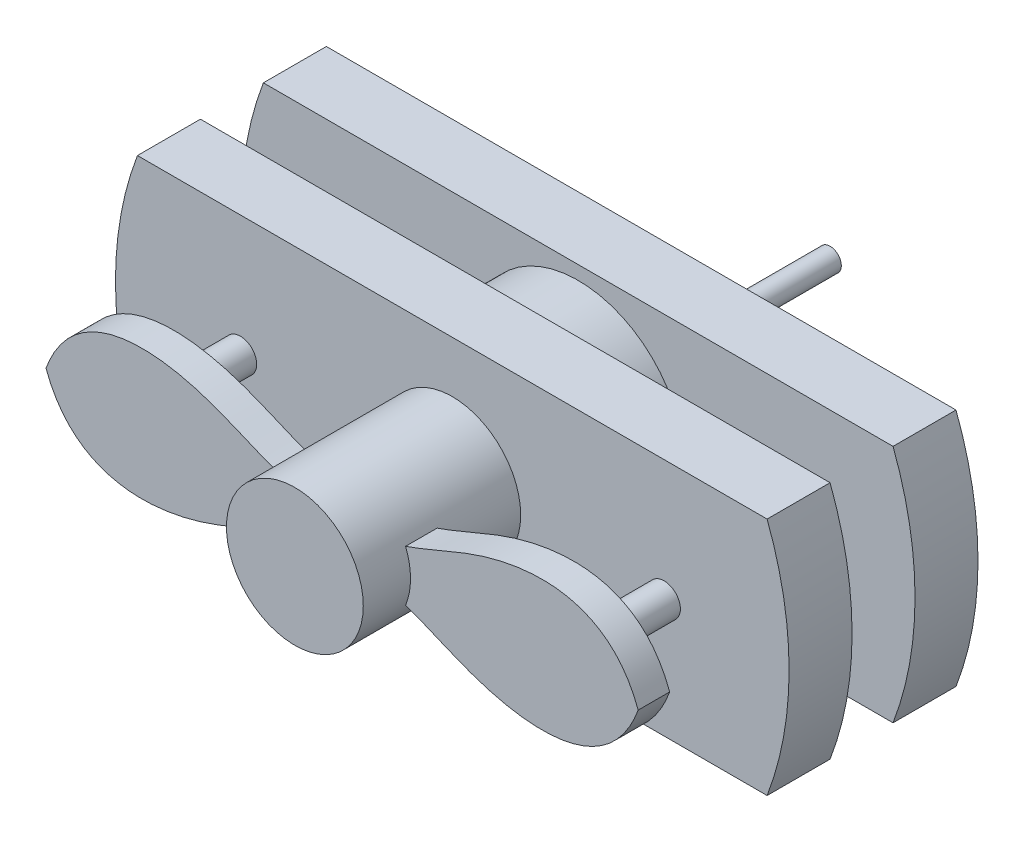
ISO-10303-21;
HEADER;
FILE_DESCRIPTION(('STEP AP214'),'2;1');
FILE_NAME('part.step','',(''),(''),'','','');
FILE_SCHEMA(('AUTOMOTIVE_DESIGN { 1 0 10303 214 1 1 1 1 }'));
ENDSEC;
DATA;
#1=APPLICATION_CONTEXT('core data for automotive mechanical design processes');
#2=APPLICATION_PROTOCOL_DEFINITION('international standard','automotive_design',2000,#1);
#3=PRODUCT_CONTEXT('',#1,'mechanical');
#4=PRODUCT('Part','Part','',(#3));
#5=PRODUCT_RELATED_PRODUCT_CATEGORY('part','',(#4));
#6=PRODUCT_DEFINITION_FORMATION('','',#4);
#7=PRODUCT_DEFINITION_CONTEXT('part definition',#1,'design');
#8=PRODUCT_DEFINITION('design','',#6,#7);
#9=PRODUCT_DEFINITION_SHAPE('','',#8);
#10=(LENGTH_UNIT() NAMED_UNIT(*) SI_UNIT(.MILLI.,.METRE.));
#11=(NAMED_UNIT(*) PLANE_ANGLE_UNIT() SI_UNIT($,.RADIAN.));
#12=(NAMED_UNIT(*) SI_UNIT($,.STERADIAN.) SOLID_ANGLE_UNIT());
#13=UNCERTAINTY_MEASURE_WITH_UNIT(LENGTH_MEASURE(1.E-05),#10,'distance_accuracy_value','');
#14=(GEOMETRIC_REPRESENTATION_CONTEXT(3) GLOBAL_UNCERTAINTY_ASSIGNED_CONTEXT((#13)) GLOBAL_UNIT_ASSIGNED_CONTEXT((#10,
#11,#12)) REPRESENTATION_CONTEXT('',''));
#15=CARTESIAN_POINT('',(0.,0.,0.));
#16=DIRECTION('',(0.,0.,1.));
#17=DIRECTION('',(1.,0.,0.));
#18=AXIS2_PLACEMENT_3D('',#15,#16,#17);
#19=CARTESIAN_POINT('',(0.755698973987045,4.82947367232855,12.065));
#20=CARTESIAN_POINT('',(1.86014304103616,1.82870450723201,12.065));
#21=CARTESIAN_POINT('',(7.0613499811201,1.87919125199209,12.065));
#22=CARTESIAN_POINT('',(10.5892667055945,4.31869419361788,12.065));
#23=CARTESIAN_POINT('',(12.7,4.20147434003299,12.065));
#24=B_SPLINE_CURVE_WITH_KNOTS('',3,(#19,#20,#21,#22,#23),.UNSPECIFIED.,.F.,.F.,(4,1,4),(0.,
0.565556179346846,1.),.UNSPECIFIED.);
#25=DIRECTION('',(0.,0.,-1.));
#26=VECTOR('',#25,1.);
#27=SURFACE_OF_LINEAR_EXTRUSION('',#24,#26);
#28=DIRECTION('',(0.,0.,-1.));
#29=VECTOR('',#28,1.);
#30=CARTESIAN_POINT('',(10.1397042127752,3.79972743013011,12.065));
#31=LINE('',#30,#29);
#32=CARTESIAN_POINT('',(10.1397042127752,3.79972743013011,12.065));
#33=VERTEX_POINT('',#32);
#34=CARTESIAN_POINT('',(10.1397042127752,3.79972743013011,10.795));
#35=VERTEX_POINT('',#34);
#36=EDGE_CURVE('E221',#33,#35,#31,.T.);
#37=ORIENTED_EDGE('',*,*,#36,.F.);
#38=CARTESIAN_POINT('',(0.755698973987044,4.82947367232855,12.065));
#39=VERTEX_POINT('',#38);
#40=EDGE_CURVE('E170',#39,#33,#24,.T.);
#41=ORIENTED_EDGE('',*,*,#40,.F.);
#42=DIRECTION('',(0.,0.,-1.));
#43=VECTOR('',#42,1.);
#44=CARTESIAN_POINT('',(0.755698973987044,4.82947367232855,12.065));
#45=LINE('',#44,#43);
#46=CARTESIAN_POINT('',(0.755698973987044,4.82947367232855,10.795));
#47=VERTEX_POINT('',#46);
#48=EDGE_CURVE('E168',#39,#47,#45,.T.);
#49=ORIENTED_EDGE('',*,*,#48,.T.);
#50=CARTESIAN_POINT('',(0.755698973987045,4.82947367232855,10.795));
#51=CARTESIAN_POINT('',(1.86014304103616,1.82870450723201,10.795));
#52=CARTESIAN_POINT('',(7.0613499811201,1.87919125199209,10.795));
#53=CARTESIAN_POINT('',(10.5892667055945,4.31869419361788,10.795));
#54=CARTESIAN_POINT('',(12.7,4.20147434003299,10.795));
#55=B_SPLINE_CURVE_WITH_KNOTS('',3,(#50,#51,#52,#53,#54),.UNSPECIFIED.,.F.,.F.,(4,1,4),(0.,
0.565556179346846,1.),.UNSPECIFIED.);
#56=EDGE_CURVE('E216',#47,#35,#55,.T.);
#57=ORIENTED_EDGE('',*,*,#56,.T.);
#58=EDGE_LOOP('',(#37,#41,#49,#57));
#59=FACE_BOUND('',#58,.T.);
#60=ADVANCED_FACE('F45',(#59),#27,.F.);
#61=CARTESIAN_POINT('',(12.7,4.20147434003299,12.065));
#62=CARTESIAN_POINT('',(14.8107332944055,4.31869419361788,12.065));
#63=CARTESIAN_POINT('',(18.3386500188799,1.8791912519921,12.065));
#64=CARTESIAN_POINT('',(23.5398569589638,1.82870450723202,12.065));
#65=CARTESIAN_POINT('',(24.644301026013,4.82947367232855,12.065));
#66=B_SPLINE_CURVE_WITH_KNOTS('',3,(#61,#62,#63,#64,#65),.UNSPECIFIED.,.F.,.F.,(4,1,4),(0.,
0.434443820653154,1.),.UNSPECIFIED.);
#67=DIRECTION('',(0.,0.,-1.));
#68=VECTOR('',#67,1.);
#69=SURFACE_OF_LINEAR_EXTRUSION('',#66,#68);
#70=DIRECTION('',(0.,0.,-1.));
#71=VECTOR('',#70,1.);
#72=CARTESIAN_POINT('',(15.2602957872248,3.79972743013011,12.065));
#73=LINE('',#72,#71);
#74=CARTESIAN_POINT('',(15.2602957872248,3.79972743013011,10.795));
#75=VERTEX_POINT('',#74);
#76=CARTESIAN_POINT('',(15.2602957872248,3.79972743013011,12.065));
#77=VERTEX_POINT('',#76);
#78=EDGE_CURVE('E68',#75,#77,#73,.F.);
#79=ORIENTED_EDGE('',*,*,#78,.F.);
#80=CARTESIAN_POINT('',(12.7,4.20147434003299,10.795));
#81=CARTESIAN_POINT('',(14.8107332944055,4.31869419361788,10.795));
#82=CARTESIAN_POINT('',(18.3386500188799,1.8791912519921,10.795));
#83=CARTESIAN_POINT('',(23.5398569589638,1.82870450723202,10.795));
#84=CARTESIAN_POINT('',(24.644301026013,4.82947367232855,10.795));
#85=B_SPLINE_CURVE_WITH_KNOTS('',3,(#80,#81,#82,#83,#84),.UNSPECIFIED.,.F.,.F.,(4,1,4),(0.,
0.434443820653154,1.),.UNSPECIFIED.);
#86=CARTESIAN_POINT('',(24.644301026013,4.82947367232855,10.795));
#87=VERTEX_POINT('',#86);
#88=EDGE_CURVE('E369',#75,#87,#85,.T.);
#89=ORIENTED_EDGE('',*,*,#88,.T.);
#90=DIRECTION('',(0.,0.,-1.));
#91=VECTOR('',#90,1.);
#92=CARTESIAN_POINT('',(24.644301026013,4.82947367232855,12.065));
#93=LINE('',#92,#91);
#94=CARTESIAN_POINT('',(24.644301026013,4.82947367232855,12.065));
#95=VERTEX_POINT('',#94);
#96=EDGE_CURVE('E291',#95,#87,#93,.T.);
#97=ORIENTED_EDGE('',*,*,#96,.F.);
#98=EDGE_CURVE('E164',#77,#95,#66,.T.);
#99=ORIENTED_EDGE('',*,*,#98,.F.);
#100=EDGE_LOOP('',(#79,#89,#97,#99));
#101=FACE_BOUND('',#100,.T.);
#102=ADVANCED_FACE('F191',(#101),#69,.F.);
#103=CARTESIAN_POINT('',(24.644301026013,4.82947367232855,12.065));
#104=CARTESIAN_POINT('',(23.5398569589638,7.83024283742508,12.065));
#105=CARTESIAN_POINT('',(18.3386500188799,7.779756092665,12.065));
#106=CARTESIAN_POINT('',(14.8107332944055,5.34025315103921,12.065));
#107=CARTESIAN_POINT('',(12.7,5.4574730046241,12.065));
#108=B_SPLINE_CURVE_WITH_KNOTS('',3,(#103,#104,#105,#106,#107),.UNSPECIFIED.,.F.,.F.,(4,1,4),
(0.,0.565556179346846,1.),.UNSPECIFIED.);
#109=DIRECTION('',(0.,0.,-1.));
#110=VECTOR('',#109,1.);
#111=SURFACE_OF_LINEAR_EXTRUSION('',#108,#110);
#112=DIRECTION('',(0.,0.,-1.));
#113=VECTOR('',#112,1.);
#114=CARTESIAN_POINT('',(15.2602957872248,5.85921991452698,12.065));
#115=LINE('',#114,#113);
#116=CARTESIAN_POINT('',(15.2602957872248,5.85921991452698,12.065));
#117=VERTEX_POINT('',#116);
#118=CARTESIAN_POINT('',(15.2602957872248,5.85921991452698,10.795));
#119=VERTEX_POINT('',#118);
#120=EDGE_CURVE('E147',#117,#119,#115,.T.);
#121=ORIENTED_EDGE('',*,*,#120,.F.);
#122=EDGE_CURVE('E158',#95,#117,#108,.T.);
#123=ORIENTED_EDGE('',*,*,#122,.F.);
#124=ORIENTED_EDGE('',*,*,#96,.T.);
#125=CARTESIAN_POINT('',(24.644301026013,4.82947367232855,10.795));
#126=CARTESIAN_POINT('',(23.5398569589638,7.83024283742508,10.795));
#127=CARTESIAN_POINT('',(18.3386500188799,7.779756092665,10.795));
#128=CARTESIAN_POINT('',(14.8107332944055,5.34025315103921,10.795));
#129=CARTESIAN_POINT('',(12.7,5.4574730046241,10.795));
#130=B_SPLINE_CURVE_WITH_KNOTS('',3,(#125,#126,#127,#128,#129),.UNSPECIFIED.,.F.,.F.,(4,1,4),
(0.,0.565556179346846,1.),.UNSPECIFIED.);
#131=EDGE_CURVE('E160',#87,#119,#130,.T.);
#132=ORIENTED_EDGE('',*,*,#131,.T.);
#133=EDGE_LOOP('',(#121,#123,#124,#132));
#134=FACE_BOUND('',#133,.T.);
#135=ADVANCED_FACE('F156',(#134),#111,.F.);
#136=CARTESIAN_POINT('',(12.7,5.4574730046241,12.065));
#137=CARTESIAN_POINT('',(10.5892667055945,5.34025315103922,12.065));
#138=CARTESIAN_POINT('',(7.0613499811201,7.77975609266499,12.065));
#139=CARTESIAN_POINT('',(1.86014304103617,7.83024283742508,12.065));
#140=CARTESIAN_POINT('',(0.755698973987044,4.82947367232855,12.065));
#141=B_SPLINE_CURVE_WITH_KNOTS('',3,(#136,#137,#138,#139,#140),.UNSPECIFIED.,.F.,.F.,(4,1,4),
(0.,0.434443820653154,1.),.UNSPECIFIED.);
#142=DIRECTION('',(0.,0.,-1.));
#143=VECTOR('',#142,1.);
#144=SURFACE_OF_LINEAR_EXTRUSION('',#141,#143);
#145=DIRECTION('',(0.,0.,-1.));
#146=VECTOR('',#145,1.);
#147=CARTESIAN_POINT('',(10.1397042127752,5.85921991452698,12.065));
#148=LINE('',#147,#146);
#149=CARTESIAN_POINT('',(10.1397042127752,5.85921991452698,10.795));
#150=VERTEX_POINT('',#149);
#151=CARTESIAN_POINT('',(10.1397042127752,5.85921991452698,12.065));
#152=VERTEX_POINT('',#151);
#153=EDGE_CURVE('E60',#150,#152,#148,.F.);
#154=ORIENTED_EDGE('',*,*,#153,.F.);
#155=CARTESIAN_POINT('',(12.7,5.4574730046241,10.795));
#156=CARTESIAN_POINT('',(10.5892667055945,5.34025315103922,10.795));
#157=CARTESIAN_POINT('',(7.0613499811201,7.77975609266499,10.795));
#158=CARTESIAN_POINT('',(1.86014304103617,7.83024283742508,10.795));
#159=CARTESIAN_POINT('',(0.755698973987044,4.82947367232855,10.795));
#160=B_SPLINE_CURVE_WITH_KNOTS('',3,(#155,#156,#157,#158,#159),.UNSPECIFIED.,.F.,.F.,(4,1,4),
(0.,0.434443820653154,1.),.UNSPECIFIED.);
#161=EDGE_CURVE('E205',#150,#47,#160,.T.);
#162=ORIENTED_EDGE('',*,*,#161,.T.);
#163=ORIENTED_EDGE('',*,*,#48,.F.);
#164=EDGE_CURVE('E166',#152,#39,#141,.T.);
#165=ORIENTED_EDGE('',*,*,#164,.F.);
#166=EDGE_LOOP('',(#154,#162,#163,#165));
#167=FACE_BOUND('',#166,.T.);
#168=ADVANCED_FACE('F190',(#167),#144,.F.);
#169=CARTESIAN_POINT('',(6.35340707100454,2.40862317294275,10.795));
#170=DIRECTION('',(0.,0.,-1.));
#171=DIRECTION('',(-1.,0.,0.));
#172=AXIS2_PLACEMENT_3D('',#169,#170,#171);
#173=PLANE('',#172);
#174=CARTESIAN_POINT('',(21.2457164041783,4.76790511033868,10.795));
#175=DIRECTION('',(0.,0.,-1.));
#176=DIRECTION('',(-1.,0.,0.));
#177=AXIS2_PLACEMENT_3D('',#174,#175,#176);
#178=CIRCLE('',#177,0.655755767739178);
#179=CARTESIAN_POINT('',(20.5899606364392,4.76790511033868,10.795));
#180=VERTEX_POINT('',#179);
#181=EDGE_CURVE('E220',#180,#180,#178,.F.);
#182=ORIENTED_EDGE('',*,*,#181,.T.);
#183=EDGE_LOOP('',(#182));
#184=FACE_BOUND('',#183,.T.);
#185=ORIENTED_EDGE('',*,*,#88,.F.);
#186=CARTESIAN_POINT('',(12.7,4.82947367232855,10.795));
#187=DIRECTION('',(0.,0.,-1.));
#188=DIRECTION('',(-1.,0.,0.));
#189=AXIS2_PLACEMENT_3D('',#186,#187,#188);
#190=CIRCLE('',#189,2.75961806078354);
#191=EDGE_CURVE('E224',#75,#119,#190,.F.);
#192=ORIENTED_EDGE('',*,*,#191,.T.);
#193=ORIENTED_EDGE('',*,*,#131,.F.);
#194=EDGE_LOOP('',(#185,#192,#193));
#195=FACE_BOUND('',#194,.T.);
#196=ADVANCED_FACE('F397',(#184,#195),#173,.T.);
#197=CARTESIAN_POINT('',(21.2457164041783,4.76790511033868,12.065));
#198=DIRECTION('',(0.,0.,1.));
#199=DIRECTION('',(1.,0.,0.));
#200=AXIS2_PLACEMENT_3D('',#197,#198,#199);
#201=PLANE('',#200);
#202=ORIENTED_EDGE('',*,*,#40,.T.);
#203=CARTESIAN_POINT('',(12.7,4.82947367232855,12.065));
#204=DIRECTION('',(0.,0.,1.));
#205=DIRECTION('',(1.,0.,0.));
#206=AXIS2_PLACEMENT_3D('',#203,#204,#205);
#207=CIRCLE('',#206,2.75961806078354);
#208=EDGE_CURVE('E53',#33,#152,#207,.F.);
#209=ORIENTED_EDGE('',*,*,#208,.T.);
#210=ORIENTED_EDGE('',*,*,#164,.T.);
#211=EDGE_LOOP('',(#202,#209,#210));
#212=FACE_BOUND('',#211,.T.);
#213=ADVANCED_FACE('F395',(#212),#201,.T.);
#214=CARTESIAN_POINT('',(12.7,4.82947367232855,2.54));
#215=DIRECTION('',(0.,0.,-1.));
#216=DIRECTION('',(-1.,0.,0.));
#217=AXIS2_PLACEMENT_3D('',#214,#215,#216);
#218=CYLINDRICAL_SURFACE('',#217,13.5872666843525);
#219=CARTESIAN_POINT('',(12.7,4.82947367232855,0.));
#220=DIRECTION('',(0.,0.,1.));
#221=DIRECTION('',(1.,0.,0.));
#222=AXIS2_PLACEMENT_3D('',#219,#220,#221);
#223=CIRCLE('',#222,13.5872666843525);
#224=CARTESIAN_POINT('',(0.,9.65894734465709,0.));
#225=VERTEX_POINT('',#224);
#226=CARTESIAN_POINT('',(0.,0.,0.));
#227=VERTEX_POINT('',#226);
#228=EDGE_CURVE('E254',#225,#227,#223,.T.);
#229=ORIENTED_EDGE('',*,*,#228,.T.);
#230=DIRECTION('',(0.,0.,-1.));
#231=VECTOR('',#230,1.);
#232=CARTESIAN_POINT('',(0.,0.,2.54));
#233=LINE('',#232,#231);
#234=CARTESIAN_POINT('',(0.,0.,2.54));
#235=VERTEX_POINT('',#234);
#236=EDGE_CURVE('E284',#235,#227,#233,.T.);
#237=ORIENTED_EDGE('',*,*,#236,.F.);
#238=CARTESIAN_POINT('',(12.7,4.82947367232855,2.54));
#239=DIRECTION('',(0.,0.,1.));
#240=DIRECTION('',(1.,0.,0.));
#241=AXIS2_PLACEMENT_3D('',#238,#239,#240);
#242=CIRCLE('',#241,13.5872666843525);
#243=CARTESIAN_POINT('',(0.,9.65894734465709,2.54));
#244=VERTEX_POINT('',#243);
#245=EDGE_CURVE('E275',#244,#235,#242,.T.);
#246=ORIENTED_EDGE('',*,*,#245,.F.);
#247=DIRECTION('',(0.,0.,-1.));
#248=VECTOR('',#247,1.);
#249=CARTESIAN_POINT('',(0.,9.65894734465709,2.54));
#250=LINE('',#249,#248);
#251=EDGE_CURVE('E276',#244,#225,#250,.T.);
#252=ORIENTED_EDGE('',*,*,#251,.T.);
#253=EDGE_LOOP('',(#229,#237,#246,#252));
#254=FACE_BOUND('',#253,.T.);
#255=ADVANCED_FACE('F47',(#254),#218,.T.);
#256=CARTESIAN_POINT('',(0.,0.,2.54));
#257=DIRECTION('',(0.,1.,0.));
#258=DIRECTION('',(0.,0.,1.));
#259=AXIS2_PLACEMENT_3D('',#256,#257,#258);
#260=PLANE('',#259);
#261=DIRECTION('',(1.,0.,0.));
#262=VECTOR('',#261,1.);
#263=CARTESIAN_POINT('',(0.,0.,0.));
#264=LINE('',#263,#262);
#265=CARTESIAN_POINT('',(25.4,0.,0.));
#266=VERTEX_POINT('',#265);
#267=EDGE_CURVE('E257',#227,#266,#264,.T.);
#268=ORIENTED_EDGE('',*,*,#267,.T.);
#269=DIRECTION('',(0.,0.,-1.));
#270=VECTOR('',#269,1.);
#271=CARTESIAN_POINT('',(25.4,0.,2.54));
#272=LINE('',#271,#270);
#273=CARTESIAN_POINT('',(25.4,0.,2.54));
#274=VERTEX_POINT('',#273);
#275=EDGE_CURVE('E281',#274,#266,#272,.T.);
#276=ORIENTED_EDGE('',*,*,#275,.F.);
#277=DIRECTION('',(1.,0.,0.));
#278=VECTOR('',#277,1.);
#279=CARTESIAN_POINT('',(0.,0.,2.54));
#280=LINE('',#279,#278);
#281=EDGE_CURVE('E315',#235,#274,#280,.T.);
#282=ORIENTED_EDGE('',*,*,#281,.F.);
#283=ORIENTED_EDGE('',*,*,#236,.T.);
#284=EDGE_LOOP('',(#268,#276,#282,#283));
#285=FACE_BOUND('',#284,.T.);
#286=ADVANCED_FACE('F321',(#285),#260,.F.);
#287=CARTESIAN_POINT('',(12.7,4.82947367232855,2.54));
#288=DIRECTION('',(0.,0.,-1.));
#289=DIRECTION('',(-1.,0.,0.));
#290=AXIS2_PLACEMENT_3D('',#287,#288,#289);
#291=CYLINDRICAL_SURFACE('',#290,13.5872666843525);
#292=CARTESIAN_POINT('',(12.7,4.82947367232855,0.));
#293=DIRECTION('',(0.,0.,1.));
#294=DIRECTION('',(-1.,0.,0.));
#295=AXIS2_PLACEMENT_3D('',#292,#293,#294);
#296=CIRCLE('',#295,13.5872666843525);
#297=CARTESIAN_POINT('',(25.4,9.65894734465709,0.));
#298=VERTEX_POINT('',#297);
#299=EDGE_CURVE('E264',#266,#298,#296,.T.);
#300=ORIENTED_EDGE('',*,*,#299,.T.);
#301=DIRECTION('',(0.,0.,-1.));
#302=VECTOR('',#301,1.);
#303=CARTESIAN_POINT('',(25.4,9.65894734465709,2.54));
#304=LINE('',#303,#302);
#305=CARTESIAN_POINT('',(25.4,9.65894734465709,2.54));
#306=VERTEX_POINT('',#305);
#307=EDGE_CURVE('E278',#306,#298,#304,.T.);
#308=ORIENTED_EDGE('',*,*,#307,.F.);
#309=CARTESIAN_POINT('',(12.7,4.82947367232855,2.54));
#310=DIRECTION('',(0.,0.,1.));
#311=DIRECTION('',(-1.,0.,0.));
#312=AXIS2_PLACEMENT_3D('',#309,#310,#311);
#313=CIRCLE('',#312,13.5872666843525);
#314=EDGE_CURVE('E323',#274,#306,#313,.T.);
#315=ORIENTED_EDGE('',*,*,#314,.F.);
#316=ORIENTED_EDGE('',*,*,#275,.T.);
#317=EDGE_LOOP('',(#300,#308,#315,#316));
#318=FACE_BOUND('',#317,.T.);
#319=ADVANCED_FACE('F546',(#318),#291,.T.);
#320=CARTESIAN_POINT('',(0.,9.65894734465709,2.54));
#321=DIRECTION('',(0.,-1.,0.));
#322=DIRECTION('',(1.,0.,0.));
#323=AXIS2_PLACEMENT_3D('',#320,#321,#322);
#324=PLANE('',#323);
#325=DIRECTION('',(-1.,0.,0.));
#326=VECTOR('',#325,1.);
#327=CARTESIAN_POINT('',(0.,9.65894734465709,0.));
#328=LINE('',#327,#326);
#329=EDGE_CURVE('E256',#298,#225,#328,.T.);
#330=ORIENTED_EDGE('',*,*,#329,.T.);
#331=ORIENTED_EDGE('',*,*,#251,.F.);
#332=DIRECTION('',(-1.,0.,0.));
#333=VECTOR('',#332,1.);
#334=CARTESIAN_POINT('',(0.,9.65894734465709,2.54));
#335=LINE('',#334,#333);
#336=EDGE_CURVE('E270',#306,#244,#335,.T.);
#337=ORIENTED_EDGE('',*,*,#336,.F.);
#338=ORIENTED_EDGE('',*,*,#307,.T.);
#339=EDGE_LOOP('',(#330,#331,#337,#338));
#340=FACE_BOUND('',#339,.T.);
#341=ADVANCED_FACE('F306',(#340),#324,.F.);
#342=CARTESIAN_POINT('',(12.7,4.82947367232855,2.54));
#343=DIRECTION('',(0.,0.,1.));
#344=DIRECTION('',(1.,0.,0.));
#345=AXIS2_PLACEMENT_3D('',#342,#343,#344);
#346=PLANE('',#345);
#347=CARTESIAN_POINT('',(4.15428359582166,4.76790511033868,2.54));
#348=DIRECTION('',(0.,0.,1.));
#349=DIRECTION('',(1.,0.,0.));
#350=AXIS2_PLACEMENT_3D('',#347,#348,#349);
#351=CIRCLE('',#350,0.655755767739178);
#352=CARTESIAN_POINT('',(4.81003936356084,4.76790511033868,2.54));
#353=VERTEX_POINT('',#352);
#354=EDGE_CURVE('E152',#353,#353,#351,.T.);
#355=ORIENTED_EDGE('',*,*,#354,.F.);
#356=EDGE_LOOP('',(#355));
#357=FACE_BOUND('',#356,.T.);
#358=CARTESIAN_POINT('',(21.2457164041783,4.76790511033868,2.54));
#359=DIRECTION('',(0.,0.,1.));
#360=DIRECTION('',(1.,0.,0.));
#361=AXIS2_PLACEMENT_3D('',#358,#359,#360);
#362=CIRCLE('',#361,0.655755767739178);
#363=CARTESIAN_POINT('',(21.9014721719175,4.76790511033868,2.54));
#364=VERTEX_POINT('',#363);
#365=EDGE_CURVE('E292',#364,#364,#362,.T.);
#366=ORIENTED_EDGE('',*,*,#365,.F.);
#367=EDGE_LOOP('',(#366));
#368=FACE_BOUND('',#367,.T.);
#369=CARTESIAN_POINT('',(12.7,4.82947367232855,2.54));
#370=DIRECTION('',(0.,0.,1.));
#371=DIRECTION('',(1.,0.,0.));
#372=AXIS2_PLACEMENT_3D('',#369,#370,#371);
#373=CIRCLE('',#372,4.2771853277988);
#374=CARTESIAN_POINT('',(16.9771853277988,4.82947367232855,2.54));
#375=VERTEX_POINT('',#374);
#376=EDGE_CURVE('E286',#375,#375,#373,.T.);
#377=ORIENTED_EDGE('',*,*,#376,.F.);
#378=EDGE_LOOP('',(#377));
#379=FACE_BOUND('',#378,.T.);
#380=ORIENTED_EDGE('',*,*,#245,.T.);
#381=ORIENTED_EDGE('',*,*,#281,.T.);
#382=ORIENTED_EDGE('',*,*,#314,.T.);
#383=ORIENTED_EDGE('',*,*,#336,.T.);
#384=EDGE_LOOP('',(#380,#381,#382,#383));
#385=FACE_BOUND('',#384,.T.);
#386=ADVANCED_FACE('F249',(#357,#368,#379,#385),#346,.T.);
#387=CARTESIAN_POINT('',(12.7,4.82947367232855,0.));
#388=DIRECTION('',(0.,0.,1.));
#389=DIRECTION('',(1.,0.,0.));
#390=AXIS2_PLACEMENT_3D('',#387,#388,#389);
#391=PLANE('',#390);
#392=CARTESIAN_POINT('',(12.7,4.76783658661913,0.));
#393=DIRECTION('',(0.,0.,1.));
#394=DIRECTION('',(1.,0.,0.));
#395=AXIS2_PLACEMENT_3D('',#392,#393,#394);
#396=CIRCLE('',#395,0.45327361328714);
#397=CARTESIAN_POINT('',(13.1532736132871,4.76783658661913,0.));
#398=VERTEX_POINT('',#397);
#399=EDGE_CURVE('E13',#398,#398,#396,.F.);
#400=ORIENTED_EDGE('',*,*,#399,.F.);
#401=EDGE_LOOP('',(#400));
#402=FACE_BOUND('',#401,.T.);
#403=ORIENTED_EDGE('',*,*,#228,.F.);
#404=ORIENTED_EDGE('',*,*,#329,.F.);
#405=ORIENTED_EDGE('',*,*,#299,.F.);
#406=ORIENTED_EDGE('',*,*,#267,.F.);
#407=EDGE_LOOP('',(#403,#404,#405,#406));
#408=FACE_BOUND('',#407,.T.);
#409=ADVANCED_FACE('F245',(#402,#408),#391,.F.);
#410=CARTESIAN_POINT('',(12.7,4.82947367232855,5.08));
#411=DIRECTION('',(0.,0.,-1.));
#412=DIRECTION('',(-1.,0.,0.));
#413=AXIS2_PLACEMENT_3D('',#410,#411,#412);
#414=CYLINDRICAL_SURFACE('',#413,4.2771853277988);
#415=CARTESIAN_POINT('',(12.7,4.82947367232855,5.08));
#416=DIRECTION('',(0.,0.,1.));
#417=DIRECTION('',(1.,0.,0.));
#418=AXIS2_PLACEMENT_3D('',#415,#416,#417);
#419=CIRCLE('',#418,4.2771853277988);
#420=CARTESIAN_POINT('',(16.9771853277988,4.82947367232855,5.08));
#421=VERTEX_POINT('',#420);
#422=EDGE_CURVE('E262',#421,#421,#419,.T.);
#423=ORIENTED_EDGE('',*,*,#422,.F.);
#424=EDGE_LOOP('',(#423));
#425=FACE_BOUND('',#424,.T.);
#426=ORIENTED_EDGE('',*,*,#376,.T.);
#427=EDGE_LOOP('',(#426));
#428=FACE_BOUND('',#427,.T.);
#429=ADVANCED_FACE('F248',(#425,#428),#414,.T.);
#430=CARTESIAN_POINT('',(12.7000000000002,4.82947367232855,7.62));
#431=DIRECTION('',(0.,0.,-1.));
#432=DIRECTION('',(-1.,0.,0.));
#433=AXIS2_PLACEMENT_3D('',#430,#431,#432);
#434=CYLINDRICAL_SURFACE('',#433,13.5872666843526);
#435=CARTESIAN_POINT('',(12.7000000000002,4.82947367232855,5.08));
#436=DIRECTION('',(0.,0.,1.));
#437=DIRECTION('',(1.,0.,0.));
#438=AXIS2_PLACEMENT_3D('',#435,#436,#437);
#439=CIRCLE('',#438,13.5872666843526);
#440=CARTESIAN_POINT('',(0.,9.65894734465709,5.08));
#441=VERTEX_POINT('',#440);
#442=CARTESIAN_POINT('',(0.,0.,5.08));
#443=VERTEX_POINT('',#442);
#444=EDGE_CURVE('E290',#441,#443,#439,.T.);
#445=ORIENTED_EDGE('',*,*,#444,.T.);
#446=DIRECTION('',(0.,0.,-1.));
#447=VECTOR('',#446,1.);
#448=CARTESIAN_POINT('',(0.,0.,7.62));
#449=LINE('',#448,#447);
#450=CARTESIAN_POINT('',(0.,0.,7.62));
#451=VERTEX_POINT('',#450);
#452=EDGE_CURVE('E267',#451,#443,#449,.T.);
#453=ORIENTED_EDGE('',*,*,#452,.F.);
#454=CARTESIAN_POINT('',(12.7000000000002,4.82947367232855,7.62));
#455=DIRECTION('',(0.,0.,1.));
#456=DIRECTION('',(1.,0.,0.));
#457=AXIS2_PLACEMENT_3D('',#454,#455,#456);
#458=CIRCLE('',#457,13.5872666843526);
#459=CARTESIAN_POINT('',(0.,9.65894734465709,7.62));
#460=VERTEX_POINT('',#459);
#461=EDGE_CURVE('E338',#460,#451,#458,.T.);
#462=ORIENTED_EDGE('',*,*,#461,.F.);
#463=DIRECTION('',(0.,0.,-1.));
#464=VECTOR('',#463,1.);
#465=CARTESIAN_POINT('',(0.,9.65894734465709,7.62));
#466=LINE('',#465,#464);
#467=EDGE_CURVE('E332',#460,#441,#466,.T.);
#468=ORIENTED_EDGE('',*,*,#467,.T.);
#469=EDGE_LOOP('',(#445,#453,#462,#468));
#470=FACE_BOUND('',#469,.T.);
#471=ADVANCED_FACE('F520',(#470),#434,.T.);
#472=CARTESIAN_POINT('',(12.7,0.,7.62));
#473=DIRECTION('',(0.,-1.,0.));
#474=DIRECTION('',(0.,0.,-1.));
#475=AXIS2_PLACEMENT_3D('',#472,#473,#474);
#476=PLANE('',#475);
#477=DIRECTION('',(-1.,0.,0.));
#478=VECTOR('',#477,1.);
#479=CARTESIAN_POINT('',(12.7,0.,5.08));
#480=LINE('',#479,#478);
#481=CARTESIAN_POINT('',(25.4,0.,5.08));
#482=VERTEX_POINT('',#481);
#483=EDGE_CURVE('E342',#482,#443,#480,.T.);
#484=ORIENTED_EDGE('',*,*,#483,.F.);
#485=DIRECTION('',(0.,0.,-1.));
#486=VECTOR('',#485,1.);
#487=CARTESIAN_POINT('',(25.4,0.,7.62));
#488=LINE('',#487,#486);
#489=CARTESIAN_POINT('',(25.4,0.,7.62));
#490=VERTEX_POINT('',#489);
#491=EDGE_CURVE('E328',#490,#482,#488,.T.);
#492=ORIENTED_EDGE('',*,*,#491,.F.);
#493=DIRECTION('',(-1.,0.,0.));
#494=VECTOR('',#493,1.);
#495=CARTESIAN_POINT('',(12.7,0.,7.62));
#496=LINE('',#495,#494);
#497=EDGE_CURVE('E351',#490,#451,#496,.T.);
#498=ORIENTED_EDGE('',*,*,#497,.T.);
#499=ORIENTED_EDGE('',*,*,#452,.T.);
#500=EDGE_LOOP('',(#484,#492,#498,#499));
#501=FACE_BOUND('',#500,.T.);
#502=ADVANCED_FACE('F510',(#501),#476,.T.);
#503=CARTESIAN_POINT('',(12.6999999999999,4.82947367232855,7.62));
#504=DIRECTION('',(0.,0.,-1.));
#505=DIRECTION('',(-1.,0.,0.));
#506=AXIS2_PLACEMENT_3D('',#503,#504,#505);
#507=CYLINDRICAL_SURFACE('',#506,13.5872666843526);
#508=CARTESIAN_POINT('',(12.6999999999999,4.82947367232855,5.08));
#509=DIRECTION('',(0.,0.,1.));
#510=DIRECTION('',(1.,0.,0.));
#511=AXIS2_PLACEMENT_3D('',#508,#509,#510);
#512=CIRCLE('',#511,13.5872666843526);
#513=CARTESIAN_POINT('',(25.4,9.65894734465709,5.08));
#514=VERTEX_POINT('',#513);
#515=EDGE_CURVE('E339',#482,#514,#512,.T.);
#516=ORIENTED_EDGE('',*,*,#515,.T.);
#517=DIRECTION('',(0.,0.,-1.));
#518=VECTOR('',#517,1.);
#519=CARTESIAN_POINT('',(25.4,9.65894734465709,7.62));
#520=LINE('',#519,#518);
#521=CARTESIAN_POINT('',(25.4,9.65894734465709,7.62));
#522=VERTEX_POINT('',#521);
#523=EDGE_CURVE('E330',#522,#514,#520,.T.);
#524=ORIENTED_EDGE('',*,*,#523,.F.);
#525=CARTESIAN_POINT('',(12.6999999999999,4.82947367232855,7.62));
#526=DIRECTION('',(0.,0.,1.));
#527=DIRECTION('',(1.,0.,0.));
#528=AXIS2_PLACEMENT_3D('',#525,#526,#527);
#529=CIRCLE('',#528,13.5872666843526);
#530=EDGE_CURVE('E349',#490,#522,#529,.T.);
#531=ORIENTED_EDGE('',*,*,#530,.F.);
#532=ORIENTED_EDGE('',*,*,#491,.T.);
#533=EDGE_LOOP('',(#516,#524,#531,#532));
#534=FACE_BOUND('',#533,.T.);
#535=ADVANCED_FACE('F500',(#534),#507,.T.);
#536=CARTESIAN_POINT('',(12.7,9.65894734465709,7.62));
#537=DIRECTION('',(0.,1.,0.));
#538=DIRECTION('',(-1.,0.,0.));
#539=AXIS2_PLACEMENT_3D('',#536,#537,#538);
#540=PLANE('',#539);
#541=DIRECTION('',(1.,0.,0.));
#542=VECTOR('',#541,1.);
#543=CARTESIAN_POINT('',(12.7,9.65894734465709,5.08));
#544=LINE('',#543,#542);
#545=EDGE_CURVE('E335',#441,#514,#544,.T.);
#546=ORIENTED_EDGE('',*,*,#545,.F.);
#547=ORIENTED_EDGE('',*,*,#467,.F.);
#548=DIRECTION('',(1.,0.,0.));
#549=VECTOR('',#548,1.);
#550=CARTESIAN_POINT('',(12.7,9.65894734465709,7.62));
#551=LINE('',#550,#549);
#552=EDGE_CURVE('E334',#460,#522,#551,.T.);
#553=ORIENTED_EDGE('',*,*,#552,.T.);
#554=ORIENTED_EDGE('',*,*,#523,.T.);
#555=EDGE_LOOP('',(#546,#547,#553,#554));
#556=FACE_BOUND('',#555,.T.);
#557=ADVANCED_FACE('F495',(#556),#540,.T.);
#558=CARTESIAN_POINT('',(12.7000000000002,4.82947367232855,7.62));
#559=DIRECTION('',(0.,0.,1.));
#560=DIRECTION('',(1.,0.,0.));
#561=AXIS2_PLACEMENT_3D('',#558,#559,#560);
#562=PLANE('',#561);
#563=CARTESIAN_POINT('',(12.7,4.82947367232855,7.62));
#564=DIRECTION('',(0.,0.,1.));
#565=DIRECTION('',(1.,0.,0.));
#566=AXIS2_PLACEMENT_3D('',#563,#564,#565);
#567=CIRCLE('',#566,2.75961806078354);
#568=CARTESIAN_POINT('',(15.4596180607835,4.82947367232855,7.62));
#569=VERTEX_POINT('',#568);
#570=EDGE_CURVE('E227',#569,#569,#567,.T.);
#571=ORIENTED_EDGE('',*,*,#570,.F.);
#572=EDGE_LOOP('',(#571));
#573=FACE_BOUND('',#572,.T.);
#574=CARTESIAN_POINT('',(4.15428359582166,4.76790511033868,7.62));
#575=DIRECTION('',(0.,0.,1.));
#576=DIRECTION('',(1.,0.,0.));
#577=AXIS2_PLACEMENT_3D('',#574,#575,#576);
#578=CIRCLE('',#577,0.655755767739178);
#579=CARTESIAN_POINT('',(4.81003936356084,4.76790511033868,7.62));
#580=VERTEX_POINT('',#579);
#581=EDGE_CURVE('E206',#580,#580,#578,.T.);
#582=ORIENTED_EDGE('',*,*,#581,.F.);
#583=EDGE_LOOP('',(#582));
#584=FACE_BOUND('',#583,.T.);
#585=CARTESIAN_POINT('',(21.2457164041783,4.76790511033868,7.62));
#586=DIRECTION('',(0.,0.,1.));
#587=DIRECTION('',(1.,0.,0.));
#588=AXIS2_PLACEMENT_3D('',#585,#586,#587);
#589=CIRCLE('',#588,0.655755767739178);
#590=CARTESIAN_POINT('',(21.9014721719175,4.76790511033868,7.62));
#591=VERTEX_POINT('',#590);
#592=EDGE_CURVE('E295',#591,#591,#589,.T.);
#593=ORIENTED_EDGE('',*,*,#592,.F.);
#594=EDGE_LOOP('',(#593));
#595=FACE_BOUND('',#594,.T.);
#596=ORIENTED_EDGE('',*,*,#461,.T.);
#597=ORIENTED_EDGE('',*,*,#497,.F.);
#598=ORIENTED_EDGE('',*,*,#530,.T.);
#599=ORIENTED_EDGE('',*,*,#552,.F.);
#600=EDGE_LOOP('',(#596,#597,#598,#599));
#601=FACE_BOUND('',#600,.T.);
#602=ADVANCED_FACE('F477',(#573,#584,#595,#601),#562,.T.);
#603=CARTESIAN_POINT('',(12.7000000000002,4.82947367232855,5.08));
#604=DIRECTION('',(0.,0.,1.));
#605=DIRECTION('',(1.,0.,0.));
#606=AXIS2_PLACEMENT_3D('',#603,#604,#605);
#607=PLANE('',#606);
#608=CARTESIAN_POINT('',(4.15428359582166,4.76790511033868,5.08));
#609=DIRECTION('',(0.,0.,1.));
#610=DIRECTION('',(1.,0.,0.));
#611=AXIS2_PLACEMENT_3D('',#608,#609,#610);
#612=CIRCLE('',#611,0.655755767739178);
#613=CARTESIAN_POINT('',(4.81003936356084,4.76790511033868,5.08));
#614=VERTEX_POINT('',#613);
#615=EDGE_CURVE('E213',#614,#614,#612,.T.);
#616=ORIENTED_EDGE('',*,*,#615,.T.);
#617=EDGE_LOOP('',(#616));
#618=FACE_BOUND('',#617,.T.);
#619=CARTESIAN_POINT('',(21.2457164041783,4.76790511033868,5.08));
#620=DIRECTION('',(0.,0.,1.));
#621=DIRECTION('',(1.,0.,0.));
#622=AXIS2_PLACEMENT_3D('',#619,#620,#621);
#623=CIRCLE('',#622,0.655755767739178);
#624=CARTESIAN_POINT('',(21.9014721719175,4.76790511033868,5.08));
#625=VERTEX_POINT('',#624);
#626=EDGE_CURVE('E287',#625,#625,#623,.T.);
#627=ORIENTED_EDGE('',*,*,#626,.T.);
#628=EDGE_LOOP('',(#627));
#629=FACE_BOUND('',#628,.T.);
#630=ORIENTED_EDGE('',*,*,#422,.T.);
#631=EDGE_LOOP('',(#630));
#632=FACE_BOUND('',#631,.T.);
#633=ORIENTED_EDGE('',*,*,#444,.F.);
#634=ORIENTED_EDGE('',*,*,#545,.T.);
#635=ORIENTED_EDGE('',*,*,#515,.F.);
#636=ORIENTED_EDGE('',*,*,#483,.T.);
#637=EDGE_LOOP('',(#633,#634,#635,#636));
#638=FACE_BOUND('',#637,.T.);
#639=ADVANCED_FACE('F467',(#618,#629,#632,#638),#607,.F.);
#640=CARTESIAN_POINT('',(21.2457164041783,4.76790511033868,0.685242599317747));
#641=DIRECTION('',(0.,0.,1.));
#642=DIRECTION('',(1.,0.,0.));
#643=AXIS2_PLACEMENT_3D('',#640,#641,#642);
#644=CYLINDRICAL_SURFACE('',#643,0.655755767739178);
#645=ORIENTED_EDGE('',*,*,#365,.T.);
#646=EDGE_LOOP('',(#645));
#647=FACE_BOUND('',#646,.T.);
#648=ORIENTED_EDGE('',*,*,#626,.F.);
#649=EDGE_LOOP('',(#648));
#650=FACE_BOUND('',#649,.T.);
#651=ADVANCED_FACE('F416',(#647,#650),#644,.T.);
#652=ORIENTED_EDGE('',*,*,#181,.F.);
#653=EDGE_LOOP('',(#652));
#654=FACE_BOUND('',#653,.T.);
#655=ORIENTED_EDGE('',*,*,#592,.T.);
#656=EDGE_LOOP('',(#655));
#657=FACE_BOUND('',#656,.T.);
#658=ADVANCED_FACE('F411',(#654,#657),#644,.T.);
#659=CARTESIAN_POINT('',(4.15428359582166,4.76790511033868,10.795));
#660=DIRECTION('',(0.,0.,-1.));
#661=DIRECTION('',(-1.,0.,0.));
#662=AXIS2_PLACEMENT_3D('',#659,#660,#661);
#663=CIRCLE('',#662,0.655755767739178);
#664=CARTESIAN_POINT('',(3.49852782808248,4.76790511033868,10.795));
#665=VERTEX_POINT('',#664);
#666=EDGE_CURVE('E212',#665,#665,#663,.T.);
#667=ORIENTED_EDGE('',*,*,#666,.F.);
#668=EDGE_LOOP('',(#667));
#669=FACE_BOUND('',#668,.T.);
#670=ORIENTED_EDGE('',*,*,#161,.F.);
#671=EDGE_CURVE('E217',#150,#35,#190,.F.);
#672=ORIENTED_EDGE('',*,*,#671,.T.);
#673=ORIENTED_EDGE('',*,*,#56,.F.);
#674=EDGE_LOOP('',(#670,#672,#673));
#675=FACE_BOUND('',#674,.T.);
#676=ADVANCED_FACE('F391',(#669,#675),#173,.T.);
#677=ORIENTED_EDGE('',*,*,#122,.T.);
#678=EDGE_CURVE('E143',#117,#77,#207,.F.);
#679=ORIENTED_EDGE('',*,*,#678,.T.);
#680=ORIENTED_EDGE('',*,*,#98,.T.);
#681=EDGE_LOOP('',(#677,#679,#680));
#682=FACE_BOUND('',#681,.T.);
#683=ADVANCED_FACE('F163',(#682),#201,.T.);
#684=CARTESIAN_POINT('',(4.15428359582166,4.76790511033868,0.685242599317747));
#685=DIRECTION('',(0.,0.,1.));
#686=DIRECTION('',(1.,0.,0.));
#687=AXIS2_PLACEMENT_3D('',#684,#685,#686);
#688=CYLINDRICAL_SURFACE('',#687,0.655755767739178);
#689=ORIENTED_EDGE('',*,*,#581,.T.);
#690=EDGE_LOOP('',(#689));
#691=FACE_BOUND('',#690,.T.);
#692=ORIENTED_EDGE('',*,*,#666,.T.);
#693=EDGE_LOOP('',(#692));
#694=FACE_BOUND('',#693,.T.);
#695=ADVANCED_FACE('F404',(#691,#694),#688,.T.);
#696=ORIENTED_EDGE('',*,*,#354,.T.);
#697=EDGE_LOOP('',(#696));
#698=FACE_BOUND('',#697,.T.);
#699=ORIENTED_EDGE('',*,*,#615,.F.);
#700=EDGE_LOOP('',(#699));
#701=FACE_BOUND('',#700,.T.);
#702=ADVANCED_FACE('F301',(#698,#701),#688,.T.);
#703=CARTESIAN_POINT('',(12.7,4.82947367232855,13.97));
#704=DIRECTION('',(0.,0.,-1.));
#705=DIRECTION('',(-1.,0.,0.));
#706=AXIS2_PLACEMENT_3D('',#703,#704,#705);
#707=CYLINDRICAL_SURFACE('',#706,2.75961806078354);
#708=ORIENTED_EDGE('',*,*,#671,.F.);
#709=ORIENTED_EDGE('',*,*,#153,.T.);
#710=ORIENTED_EDGE('',*,*,#208,.F.);
#711=ORIENTED_EDGE('',*,*,#36,.T.);
#712=EDGE_LOOP('',(#708,#709,#710,#711));
#713=FACE_BOUND('',#712,.T.);
#714=ORIENTED_EDGE('',*,*,#191,.F.);
#715=ORIENTED_EDGE('',*,*,#78,.T.);
#716=ORIENTED_EDGE('',*,*,#678,.F.);
#717=ORIENTED_EDGE('',*,*,#120,.T.);
#718=EDGE_LOOP('',(#714,#715,#716,#717));
#719=FACE_BOUND('',#718,.T.);
#720=CARTESIAN_POINT('',(12.7,4.82947367232855,13.97));
#721=DIRECTION('',(0.,0.,1.));
#722=DIRECTION('',(1.,0.,0.));
#723=AXIS2_PLACEMENT_3D('',#720,#721,#722);
#724=CIRCLE('',#723,2.75961806078354);
#725=CARTESIAN_POINT('',(15.4596180607835,4.82947367232855,13.97));
#726=VERTEX_POINT('',#725);
#727=EDGE_CURVE('E161',#726,#726,#724,.T.);
#728=ORIENTED_EDGE('',*,*,#727,.F.);
#729=EDGE_LOOP('',(#728));
#730=FACE_BOUND('',#729,.T.);
#731=ORIENTED_EDGE('',*,*,#570,.T.);
#732=EDGE_LOOP('',(#731));
#733=FACE_BOUND('',#732,.T.);
#734=ADVANCED_FACE('F145',(#713,#719,#730,#733),#707,.T.);
#735=CARTESIAN_POINT('',(12.7,4.82947367232855,13.97));
#736=DIRECTION('',(0.,0.,1.));
#737=DIRECTION('',(1.,0.,0.));
#738=AXIS2_PLACEMENT_3D('',#735,#736,#737);
#739=PLANE('',#738);
#740=ORIENTED_EDGE('',*,*,#727,.T.);
#741=EDGE_LOOP('',(#740));
#742=FACE_BOUND('',#741,.T.);
#743=ADVANCED_FACE('F241',(#742),#739,.T.);
#744=CARTESIAN_POINT('',(12.7,4.76783658661913,-7.62));
#745=DIRECTION('',(0.,0.,1.));
#746=DIRECTION('',(1.,0.,0.));
#747=AXIS2_PLACEMENT_3D('',#744,#745,#746);
#748=CYLINDRICAL_SURFACE('',#747,0.45327361328714);
#749=CARTESIAN_POINT('',(12.7,4.76783658661913,-7.62));
#750=DIRECTION('',(0.,0.,-1.));
#751=DIRECTION('',(-1.,0.,0.));
#752=AXIS2_PLACEMENT_3D('',#749,#750,#751);
#753=CIRCLE('',#752,0.45327361328714);
#754=CARTESIAN_POINT('',(12.2467263867129,4.76783658661913,-7.62));
#755=VERTEX_POINT('',#754);
#756=EDGE_CURVE('E230',#755,#755,#753,.T.);
#757=ORIENTED_EDGE('',*,*,#756,.F.);
#758=EDGE_LOOP('',(#757));
#759=FACE_BOUND('',#758,.T.);
#760=ORIENTED_EDGE('',*,*,#399,.T.);
#761=EDGE_LOOP('',(#760));
#762=FACE_BOUND('',#761,.T.);
#763=ADVANCED_FACE('F238',(#759,#762),#748,.T.);
#764=CARTESIAN_POINT('',(12.7,4.76783658661913,-7.62));
#765=DIRECTION('',(0.,0.,-1.));
#766=DIRECTION('',(-1.,0.,0.));
#767=AXIS2_PLACEMENT_3D('',#764,#765,#766);
#768=PLANE('',#767);
#769=ORIENTED_EDGE('',*,*,#756,.T.);
#770=EDGE_LOOP('',(#769));
#771=FACE_BOUND('',#770,.T.);
#772=ADVANCED_FACE('F236',(#771),#768,.T.);
#773=CLOSED_SHELL('',(#60,#102,#135,#168,#196,#213,#255,#286,#319,#341,#386,#409,#429,#471,#502,
#535,#557,#602,#639,#651,#658,#676,#683,#695,#702,#734,#743,#763,#772));
#774=MANIFOLD_SOLID_BREP('B2',#773);
#775=ADVANCED_BREP_SHAPE_REPRESENTATION('',(#18,#774),#14);
#776=SHAPE_DEFINITION_REPRESENTATION(#9,#775);
ENDSEC;
END-ISO-10303-21;
